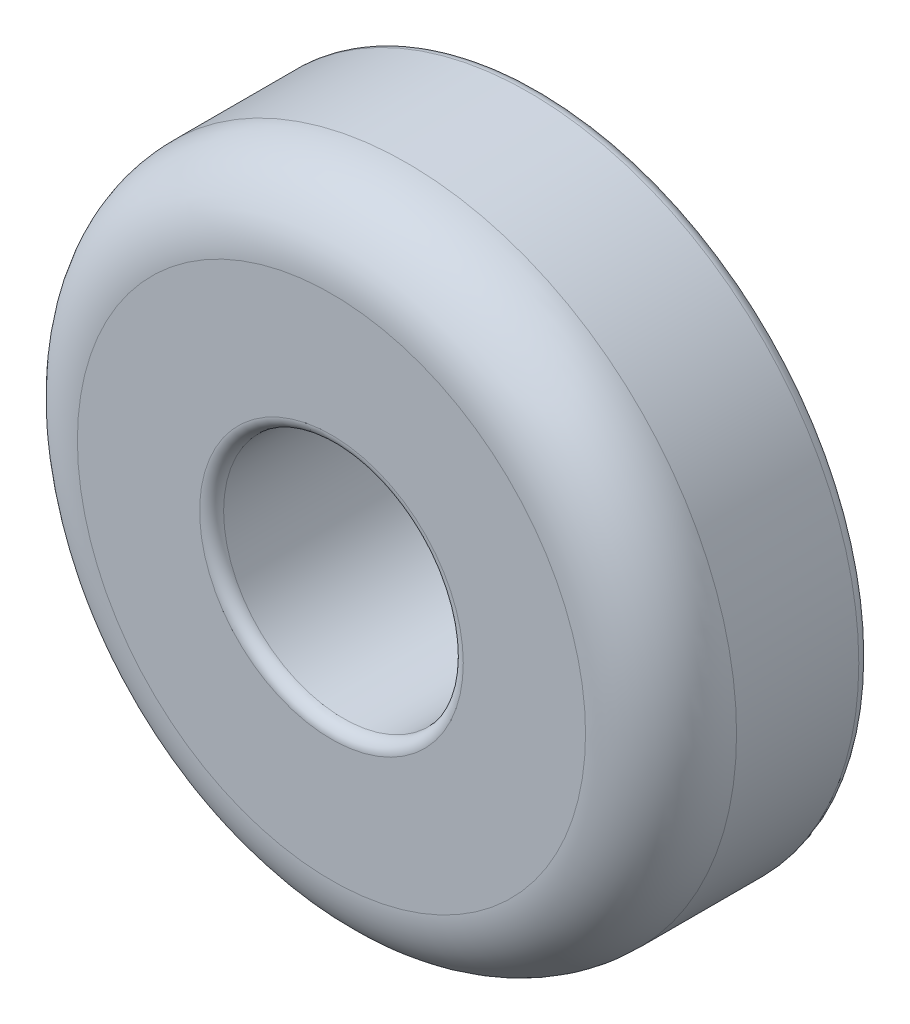
ISO-10303-21;
HEADER;
FILE_DESCRIPTION(('STEP AP214'),'2;1');
FILE_NAME('part.step','',(''),(''),'','','');
FILE_SCHEMA(('AUTOMOTIVE_DESIGN { 1 0 10303 214 1 1 1 1 }'));
ENDSEC;
DATA;
#1=APPLICATION_CONTEXT('core data for automotive mechanical design processes');
#2=APPLICATION_PROTOCOL_DEFINITION('international standard','automotive_design',2000,#1);
#3=PRODUCT_CONTEXT('',#1,'mechanical');
#4=PRODUCT('Part','Part','',(#3));
#5=PRODUCT_RELATED_PRODUCT_CATEGORY('part','',(#4));
#6=PRODUCT_DEFINITION_FORMATION('','',#4);
#7=PRODUCT_DEFINITION_CONTEXT('part definition',#1,'design');
#8=PRODUCT_DEFINITION('design','',#6,#7);
#9=PRODUCT_DEFINITION_SHAPE('','',#8);
#10=(LENGTH_UNIT() NAMED_UNIT(*) SI_UNIT(.MILLI.,.METRE.));
#11=(NAMED_UNIT(*) PLANE_ANGLE_UNIT() SI_UNIT($,.RADIAN.));
#12=(NAMED_UNIT(*) SI_UNIT($,.STERADIAN.) SOLID_ANGLE_UNIT());
#13=UNCERTAINTY_MEASURE_WITH_UNIT(LENGTH_MEASURE(1.E-05),#10,'distance_accuracy_value','');
#14=(GEOMETRIC_REPRESENTATION_CONTEXT(3) GLOBAL_UNCERTAINTY_ASSIGNED_CONTEXT((#13)) GLOBAL_UNIT_ASSIGNED_CONTEXT((#10,
#11,#12)) REPRESENTATION_CONTEXT('',''));
#15=CARTESIAN_POINT('',(0.,0.,0.));
#16=DIRECTION('',(0.,0.,1.));
#17=DIRECTION('',(1.,0.,0.));
#18=AXIS2_PLACEMENT_3D('',#15,#16,#17);
#19=CARTESIAN_POINT('',(0.,0.,1.75));
#20=DIRECTION('',(0.,0.,1.));
#21=DIRECTION('',(1.,0.,0.));
#22=AXIS2_PLACEMENT_3D('',#19,#20,#21);
#23=PLANE('',#22);
#24=CARTESIAN_POINT('',(0.,0.,1.75));
#25=DIRECTION('',(0.,0.,1.));
#26=DIRECTION('',(1.,0.,0.));
#27=AXIS2_PLACEMENT_3D('',#24,#25,#26);
#28=CIRCLE('',#27,2.12);
#29=CARTESIAN_POINT('',(2.12,0.,1.75));
#30=VERTEX_POINT('',#29);
#31=EDGE_CURVE('E55',#30,#30,#28,.T.);
#32=ORIENTED_EDGE('',*,*,#31,.T.);
#33=EDGE_LOOP('',(#32));
#34=FACE_BOUND('',#33,.T.);
#35=CARTESIAN_POINT('',(0.,0.,1.75));
#36=DIRECTION('',(0.,0.,1.));
#37=DIRECTION('',(1.,0.,0.));
#38=AXIS2_PLACEMENT_3D('',#35,#36,#37);
#39=CIRCLE('',#38,1.1);
#40=CARTESIAN_POINT('',(1.1,0.,1.75));
#41=VERTEX_POINT('',#40);
#42=EDGE_CURVE('E60',#41,#41,#39,.F.);
#43=ORIENTED_EDGE('',*,*,#42,.T.);
#44=EDGE_LOOP('',(#43));
#45=FACE_BOUND('',#44,.T.);
#46=ADVANCED_FACE('F47',(#34,#45),#23,.T.);
#47=CARTESIAN_POINT('',(0.,0.,0.));
#48=DIRECTION('',(0.,0.,1.));
#49=DIRECTION('',(1.,0.,0.));
#50=AXIS2_PLACEMENT_3D('',#47,#48,#49);
#51=PLANE('',#50);
#52=CARTESIAN_POINT('',(0.,0.,0.));
#53=DIRECTION('',(0.,0.,1.));
#54=DIRECTION('',(1.,0.,0.));
#55=AXIS2_PLACEMENT_3D('',#52,#53,#54);
#56=CIRCLE('',#55,1.1);
#57=CARTESIAN_POINT('',(1.1,0.,0.));
#58=VERTEX_POINT('',#57);
#59=EDGE_CURVE('E79',#58,#58,#56,.T.);
#60=ORIENTED_EDGE('',*,*,#59,.T.);
#61=EDGE_LOOP('',(#60));
#62=FACE_BOUND('',#61,.T.);
#63=CARTESIAN_POINT('',(0.,0.,0.));
#64=DIRECTION('',(0.,0.,1.));
#65=DIRECTION('',(1.,0.,0.));
#66=AXIS2_PLACEMENT_3D('',#63,#64,#65);
#67=CIRCLE('',#66,2.65);
#68=CARTESIAN_POINT('',(2.65,0.,0.));
#69=VERTEX_POINT('',#68);
#70=EDGE_CURVE('E83',#69,#69,#67,.F.);
#71=ORIENTED_EDGE('',*,*,#70,.T.);
#72=EDGE_LOOP('',(#71));
#73=FACE_BOUND('',#72,.T.);
#74=ADVANCED_FACE('F88',(#62,#73),#51,.F.);
#75=CARTESIAN_POINT('',(0.,0.,1.75));
#76=DIRECTION('',(0.,0.,-1.));
#77=DIRECTION('',(-1.,0.,0.));
#78=AXIS2_PLACEMENT_3D('',#75,#76,#77);
#79=CYLINDRICAL_SURFACE('',#78,2.75);
#80=CARTESIAN_POINT('',(0.,0.,1.12));
#81=DIRECTION('',(0.,0.,1.));
#82=DIRECTION('',(1.,0.,0.));
#83=AXIS2_PLACEMENT_3D('',#80,#81,#82);
#84=CIRCLE('',#83,2.75);
#85=CARTESIAN_POINT('',(2.75,0.,1.12));
#86=VERTEX_POINT('',#85);
#87=EDGE_CURVE('E11',#86,#86,#84,.F.);
#88=ORIENTED_EDGE('',*,*,#87,.T.);
#89=EDGE_LOOP('',(#88));
#90=FACE_BOUND('',#89,.T.);
#91=CARTESIAN_POINT('',(0.,0.,0.1));
#92=DIRECTION('',(0.,0.,1.));
#93=DIRECTION('',(1.,0.,0.));
#94=AXIS2_PLACEMENT_3D('',#91,#92,#93);
#95=CIRCLE('',#94,2.75);
#96=CARTESIAN_POINT('',(2.75,0.,0.1));
#97=VERTEX_POINT('',#96);
#98=EDGE_CURVE('E65',#97,#97,#95,.T.);
#99=ORIENTED_EDGE('',*,*,#98,.T.);
#100=EDGE_LOOP('',(#99));
#101=FACE_BOUND('',#100,.T.);
#102=ADVANCED_FACE('F98',(#90,#101),#79,.T.);
#103=CARTESIAN_POINT('',(0.,0.,1.75));
#104=DIRECTION('',(0.,0.,-1.));
#105=DIRECTION('',(-1.,0.,0.));
#106=AXIS2_PLACEMENT_3D('',#103,#104,#105);
#107=CYLINDRICAL_SURFACE('',#106,1.);
#108=CARTESIAN_POINT('',(0.,0.,0.1));
#109=DIRECTION('',(0.,0.,1.));
#110=DIRECTION('',(1.,0.,0.));
#111=AXIS2_PLACEMENT_3D('',#108,#109,#110);
#112=CIRCLE('',#111,1.);
#113=CARTESIAN_POINT('',(1.,0.,0.1));
#114=VERTEX_POINT('',#113);
#115=EDGE_CURVE('E71',#114,#114,#112,.F.);
#116=ORIENTED_EDGE('',*,*,#115,.T.);
#117=EDGE_LOOP('',(#116));
#118=FACE_BOUND('',#117,.T.);
#119=CARTESIAN_POINT('',(0.,0.,1.65));
#120=DIRECTION('',(0.,0.,1.));
#121=DIRECTION('',(1.,0.,0.));
#122=AXIS2_PLACEMENT_3D('',#119,#120,#121);
#123=CIRCLE('',#122,1.);
#124=CARTESIAN_POINT('',(1.,0.,1.65));
#125=VERTEX_POINT('',#124);
#126=EDGE_CURVE('E75',#125,#125,#123,.T.);
#127=ORIENTED_EDGE('',*,*,#126,.T.);
#128=EDGE_LOOP('',(#127));
#129=FACE_BOUND('',#128,.T.);
#130=ADVANCED_FACE('F100',(#118,#129),#107,.F.);
#131=CARTESIAN_POINT('',(0.,0.,0.1));
#132=DIRECTION('',(0.,0.,1.));
#133=DIRECTION('',(1.,0.,0.));
#134=AXIS2_PLACEMENT_3D('',#131,#132,#133);
#135=TOROIDAL_SURFACE('',#134,1.1,0.1);
#136=ORIENTED_EDGE('',*,*,#115,.F.);
#137=EDGE_LOOP('',(#136));
#138=FACE_BOUND('',#137,.T.);
#139=ORIENTED_EDGE('',*,*,#59,.F.);
#140=EDGE_LOOP('',(#139));
#141=FACE_BOUND('',#140,.T.);
#142=ADVANCED_FACE('F94',(#138,#141),#135,.T.);
#143=CARTESIAN_POINT('',(0.,0.,0.1));
#144=DIRECTION('',(0.,0.,1.));
#145=DIRECTION('',(1.,0.,0.));
#146=AXIS2_PLACEMENT_3D('',#143,#144,#145);
#147=TOROIDAL_SURFACE('',#146,2.65,0.1);
#148=ORIENTED_EDGE('',*,*,#70,.F.);
#149=EDGE_LOOP('',(#148));
#150=FACE_BOUND('',#149,.T.);
#151=ORIENTED_EDGE('',*,*,#98,.F.);
#152=EDGE_LOOP('',(#151));
#153=FACE_BOUND('',#152,.T.);
#154=ADVANCED_FACE('F90',(#150,#153),#147,.T.);
#155=CARTESIAN_POINT('',(0.,0.,1.65));
#156=DIRECTION('',(0.,0.,1.));
#157=DIRECTION('',(1.,0.,0.));
#158=AXIS2_PLACEMENT_3D('',#155,#156,#157);
#159=TOROIDAL_SURFACE('',#158,1.1,0.1);
#160=ORIENTED_EDGE('',*,*,#42,.F.);
#161=EDGE_LOOP('',(#160));
#162=FACE_BOUND('',#161,.T.);
#163=ORIENTED_EDGE('',*,*,#126,.F.);
#164=EDGE_LOOP('',(#163));
#165=FACE_BOUND('',#164,.T.);
#166=ADVANCED_FACE('F93',(#162,#165),#159,.T.);
#167=CARTESIAN_POINT('',(0.,0.,1.12));
#168=DIRECTION('',(0.,0.,1.));
#169=DIRECTION('',(1.,0.,0.));
#170=AXIS2_PLACEMENT_3D('',#167,#168,#169);
#171=TOROIDAL_SURFACE('',#170,2.12,0.63);
#172=ORIENTED_EDGE('',*,*,#87,.F.);
#173=EDGE_LOOP('',(#172));
#174=FACE_BOUND('',#173,.T.);
#175=ORIENTED_EDGE('',*,*,#31,.F.);
#176=EDGE_LOOP('',(#175));
#177=FACE_BOUND('',#176,.T.);
#178=ADVANCED_FACE('F49',(#174,#177),#171,.T.);
#179=CLOSED_SHELL('',(#46,#74,#102,#130,#142,#154,#166,#178));
#180=MANIFOLD_SOLID_BREP('B2',#179);
#181=ADVANCED_BREP_SHAPE_REPRESENTATION('',(#18,#180),#14);
#182=SHAPE_DEFINITION_REPRESENTATION(#9,#181);
ENDSEC;
END-ISO-10303-21;
